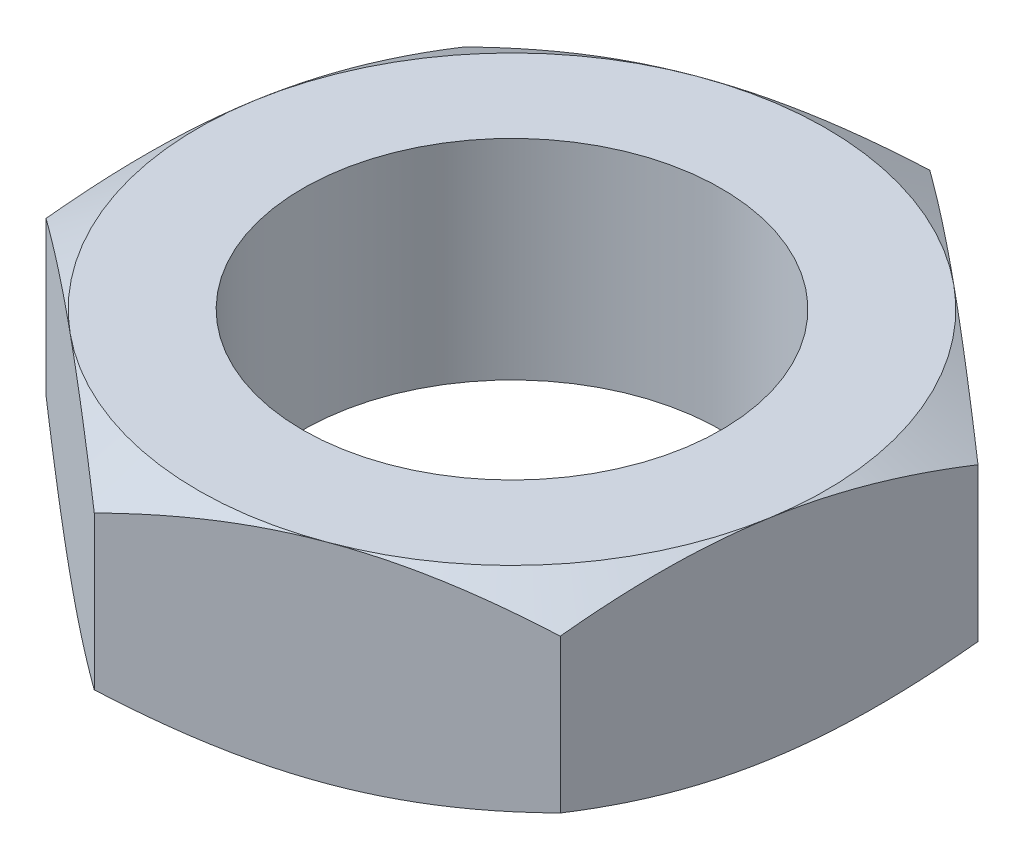
ISO-10303-21;
HEADER;
FILE_DESCRIPTION(('STEP AP214'),'2;1');
FILE_NAME('part.step','',(''),(''),'','','');
FILE_SCHEMA(('AUTOMOTIVE_DESIGN { 1 0 10303 214 1 1 1 1 }'));
ENDSEC;
DATA;
#1=APPLICATION_CONTEXT('core data for automotive mechanical design processes');
#2=APPLICATION_PROTOCOL_DEFINITION('international standard','automotive_design',2000,#1);
#3=PRODUCT_CONTEXT('',#1,'mechanical');
#4=PRODUCT('Part','Part','',(#3));
#5=PRODUCT_RELATED_PRODUCT_CATEGORY('part','',(#4));
#6=PRODUCT_DEFINITION_FORMATION('','',#4);
#7=PRODUCT_DEFINITION_CONTEXT('part definition',#1,'design');
#8=PRODUCT_DEFINITION('design','',#6,#7);
#9=PRODUCT_DEFINITION_SHAPE('','',#8);
#10=(LENGTH_UNIT() NAMED_UNIT(*) SI_UNIT(.MILLI.,.METRE.));
#11=(NAMED_UNIT(*) PLANE_ANGLE_UNIT() SI_UNIT($,.RADIAN.));
#12=(NAMED_UNIT(*) SI_UNIT($,.STERADIAN.) SOLID_ANGLE_UNIT());
#13=UNCERTAINTY_MEASURE_WITH_UNIT(LENGTH_MEASURE(1.E-05),#10,'distance_accuracy_value','');
#14=(GEOMETRIC_REPRESENTATION_CONTEXT(3) GLOBAL_UNCERTAINTY_ASSIGNED_CONTEXT((#13)) GLOBAL_UNIT_ASSIGNED_CONTEXT((#10,
#11,#12)) REPRESENTATION_CONTEXT('',''));
#15=CARTESIAN_POINT('',(0.,0.,0.));
#16=DIRECTION('',(0.,0.,1.));
#17=DIRECTION('',(1.,0.,0.));
#18=AXIS2_PLACEMENT_3D('',#15,#16,#17);
#19=CARTESIAN_POINT('',(-1.44369467023749,5.,8.53907171179209));
#20=DIRECTION('',(-0.34863406811952,0.,-0.937258921828133));
#21=DIRECTION('',(-0.937258921828133,0.,0.34863406811952));
#22=AXIS2_PLACEMENT_3D('',#19,#20,#21);
#23=PLANE('',#22);
#24=CARTESIAN_POINT('',(6.67340569203028,0.669934582085275,5.51973772123151));
#25=CARTESIAN_POINT('',(6.49498732644152,0.61499041368803,5.58610435607892));
#26=CARTESIAN_POINT('',(6.31590373120375,0.562539844764627,5.65271843772397));
#27=CARTESIAN_POINT('',(5.95628219341445,0.463312688605474,5.78648757748136));
#28=CARTESIAN_POINT('',(5.77574365902302,0.416538549046466,5.85364285574156));
#29=CARTESIAN_POINT('',(5.23123744179099,0.285648891076474,6.05618391799114));
#30=CARTESIAN_POINT('',(4.86512041892743,0.211200490063354,6.19236919627024));
#31=CARTESIAN_POINT('',(4.31723296252882,0.123901221271782,6.39616798478786));
#32=CARTESIAN_POINT('',(4.13709953241467,0.0990322370979437,6.46317257560309));
#33=CARTESIAN_POINT('',(3.77601876178583,0.0573306993877993,6.59748450910651));
#34=CARTESIAN_POINT('',(3.59507149461047,0.0404974357964017,6.66479182451452));
#35=CARTESIAN_POINT('',(3.23286270958824,0.0152963397422831,6.79952334777878));
#36=CARTESIAN_POINT('',(3.05160178328159,0.00691890019796405,6.86694733559865));
#37=CARTESIAN_POINT('',(2.68892251831363,-0.00119990207370901,7.0018538642255));
#38=CARTESIAN_POINT('',(2.50750418468866,-0.000941531608342203,7.0693364031591));
#39=CARTESIAN_POINT('',(2.01048216082673,0.0116366203444909,7.25421467541497));
#40=CARTESIAN_POINT('',(1.69504118336627,0.032750367326311,7.37154988414164));
#41=CARTESIAN_POINT('',(1.06625435166348,0.0997010500425559,7.60544097443817));
#42=CARTESIAN_POINT('',(0.752910708611471,0.145560867086196,7.72199603350715));
#43=CARTESIAN_POINT('',(0.122858541479935,0.260196634976687,7.95635779314358));
#44=CARTESIAN_POINT('',(-0.19377048564775,0.32945826489346,8.0741349230715));
#45=CARTESIAN_POINT('',(-0.822306823607496,0.486654039468555,8.30793283671146));
#46=CARTESIAN_POINT('',(-1.13422218333332,0.574551261711175,8.42395661438654));
#47=CARTESIAN_POINT('',(-1.44389467023749,0.669934582085275,8.53914610619048));
#48=B_SPLINE_CURVE_WITH_KNOTS('',3,(#24,#25,#26,#27,#28,#29,#30,#31,#32,#33,#34,#35,#36,#37,#38,
#39,#40,#41,#42,#43,#44,#45,#46,#47),.UNSPECIFIED.,.F.,.F.,(4,2,2,2,2,2,2,2,2,2,2,4),(0.,
0.594350167566524,1.18895571516085,2.38063749631713,2.96188394546358,3.54307902480116,
4.12361303374696,4.70412910684701,5.71472439101079,6.7262557214494,7.76022088252539,
8.79215629474527),.UNSPECIFIED.);
#49=CARTESIAN_POINT('',(6.67320569203028,0.669872981077802,5.5198121156299));
#50=VERTEX_POINT('',#49);
#51=CARTESIAN_POINT('',(2.6147555108964,0.,7.029441913711));
#52=VERTEX_POINT('',#51);
#53=EDGE_CURVE('E129',#50,#52,#48,.T.);
#54=ORIENTED_EDGE('',*,*,#53,.F.);
#55=DIRECTION('',(0.,-1.,0.));
#56=VECTOR('',#55,1.);
#57=CARTESIAN_POINT('',(6.67320569203028,5.,5.5198121156299));
#58=LINE('',#57,#56);
#59=CARTESIAN_POINT('',(6.67320569203028,4.3301270189222,5.5198121156299));
#60=VERTEX_POINT('',#59);
#61=EDGE_CURVE('E260',#60,#50,#58,.T.);
#62=ORIENTED_EDGE('',*,*,#61,.F.);
#63=CARTESIAN_POINT('',(-1.44389467023749,4.33006541791473,8.53914610619048));
#64=CARTESIAN_POINT('',(-1.26547630464873,4.38500958631197,8.47277947134307));
#65=CARTESIAN_POINT('',(-1.08639270941096,4.43746015523537,8.40616538969802));
#66=CARTESIAN_POINT('',(-0.726771171621659,4.53668731139453,8.27239624994063));
#67=CARTESIAN_POINT('',(-0.54623263723023,4.58346145095353,8.20524097168044));
#68=CARTESIAN_POINT('',(-0.00172641999819813,4.71435110892353,8.00269990943085));
#69=CARTESIAN_POINT('',(0.364390602865364,4.78879950993665,7.86651463115175));
#70=CARTESIAN_POINT('',(0.912278059263968,4.87609877872822,7.66271584263413));
#71=CARTESIAN_POINT('',(1.09241148937812,4.90096776290206,7.5957112518189));
#72=CARTESIAN_POINT('',(1.45349226000696,4.9426693006122,7.46139931831548));
#73=CARTESIAN_POINT('',(1.63443952718232,4.9595025642036,7.39409200290748));
#74=CARTESIAN_POINT('',(1.99664831220455,4.98470366025772,7.25936047964321));
#75=CARTESIAN_POINT('',(2.1779092385112,4.99308109980204,7.19193649182334));
#76=CARTESIAN_POINT('',(2.54058850347916,5.00119990207371,7.0570299631965));
#77=CARTESIAN_POINT('',(2.72200683710413,5.00094153160834,6.98954742426289));
#78=CARTESIAN_POINT('',(3.21902886096606,4.98836337965551,6.80466915200702));
#79=CARTESIAN_POINT('',(3.53446983842652,4.96724963267369,6.68733394328035));
#80=CARTESIAN_POINT('',(4.16325667012932,4.90029894995745,6.45344285298383));
#81=CARTESIAN_POINT('',(4.47660031318132,4.85443913291381,6.33688779391484));
#82=CARTESIAN_POINT('',(5.10665248031286,4.73980336502331,6.10252603427841));
#83=CARTESIAN_POINT('',(5.42328150744054,4.67054173510654,5.98474890435049));
#84=CARTESIAN_POINT('',(6.05181784540029,4.51334596053145,5.75095099071054));
#85=CARTESIAN_POINT('',(6.36373320512611,4.42544873828883,5.63492721303545));
#86=CARTESIAN_POINT('',(6.67340569203028,4.33006541791473,5.51973772123151));
#87=B_SPLINE_CURVE_WITH_KNOTS('',3,(#63,#64,#65,#66,#67,#68,#69,#70,#71,#72,#73,#74,#75,#76,#77,
#78,#79,#80,#81,#82,#83,#84,#85,#86),.UNSPECIFIED.,.F.,.F.,(4,2,2,2,2,2,2,2,2,2,2,4),(0.,
0.594350167566525,1.18895571516085,2.38063749631713,2.96188394546359,3.54307902480116,
4.12361303374696,4.70412910684701,5.71472439101079,6.72625572144941,7.76022088252539,
8.79215629474527),.UNSPECIFIED.);
#88=CARTESIAN_POINT('',(2.6147555108964,5.,7.029441913711));
#89=VERTEX_POINT('',#88);
#90=EDGE_CURVE('E240',#89,#60,#87,.T.);
#91=ORIENTED_EDGE('',*,*,#90,.F.);
#92=CARTESIAN_POINT('',(-1.44369467023749,4.3301270189222,8.53907171179209));
#93=VERTEX_POINT('',#92);
#94=EDGE_CURVE('E246',#93,#89,#87,.T.);
#95=ORIENTED_EDGE('',*,*,#94,.F.);
#96=DIRECTION('',(0.,-1.,0.));
#97=VECTOR('',#96,1.);
#98=CARTESIAN_POINT('',(-1.44369467023749,5.,8.53907171179209));
#99=LINE('',#98,#97);
#100=CARTESIAN_POINT('',(-1.44369467023749,0.669872981077804,8.53907171179209));
#101=VERTEX_POINT('',#100);
#102=EDGE_CURVE('E159',#93,#101,#99,.T.);
#103=ORIENTED_EDGE('',*,*,#102,.T.);
#104=EDGE_CURVE('E141',#52,#101,#48,.T.);
#105=ORIENTED_EDGE('',*,*,#104,.F.);
#106=EDGE_LOOP('',(#54,#62,#91,#95,#103,#105));
#107=FACE_BOUND('',#106,.T.);
#108=ADVANCED_FACE('F39',(#107),#23,.F.);
#109=CARTESIAN_POINT('',(6.67320569203028,5.,5.5198121156299));
#110=DIRECTION('',(-0.986007070286536,0.,-0.166703501297848));
#111=DIRECTION('',(-0.166703501297848,0.,0.986007070286536));
#112=AXIS2_PLACEMENT_3D('',#109,#110,#111);
#113=PLANE('',#112);
#114=CARTESIAN_POINT('',(8.11693417612292,0.669931536480535,-3.01945959616219));
#115=CARTESIAN_POINT('',(8.08520019987834,0.614987494088027,-2.83176152922384));
#116=CARTESIAN_POINT('',(8.05334790409476,0.562537054216301,-2.64336363354107));
#117=CARTESIAN_POINT('',(7.98938463854219,0.463310161762978,-2.26503785404365));
#118=CARTESIAN_POINT('',(7.95727356350703,0.416536156859956,-2.07510934760759));
#119=CARTESIAN_POINT('',(7.86042620741353,0.285646912260097,-1.50228287963715));
#120=CARTESIAN_POINT('',(7.79530763940616,0.211198797092288,-1.1171237920216));
#121=CARTESIAN_POINT('',(7.69785888875528,0.123899954229493,-0.54074023448197));
#122=CARTESIAN_POINT('',(7.66581986681431,0.0990311093659153,-0.351237903019766));
#123=CARTESIAN_POINT('',(7.60159705945798,0.0573298489513181,0.0286229975251619));
#124=CARTESIAN_POINT('',(7.56941328708685,0.0404967233463565,0.218981489454665));
#125=CARTESIAN_POINT('',(7.50498984963335,0.0152958983657101,0.600029063901352));
#126=CARTESIAN_POINT('',(7.47275028976229,0.00691859196391466,0.790717524121497));
#127=CARTESIAN_POINT('',(7.40824317319374,-0.00119995198440777,1.17226003837705));
#128=CARTESIAN_POINT('',(7.37597561739202,-0.000941456342233854,1.36311408711427));
#129=CARTESIAN_POINT('',(7.2875741645718,0.0116369901313172,1.88598527353643));
#130=CARTESIAN_POINT('',(7.23146920871259,0.0327507878641885,2.21783123192727));
#131=CARTESIAN_POINT('',(7.11963193933104,0.0997013333310604,2.87931906795497));
#132=CARTESIAN_POINT('',(7.06390001908873,0.145560961828871,3.20895861944455));
#133=CARTESIAN_POINT('',(6.95183769884847,0.260196141216312,3.87177757171231));
#134=CARTESIAN_POINT('',(6.89552143817182,0.329457363606809,4.20487334214886));
#135=CARTESIAN_POINT('',(6.78372872548718,0.486652168279931,4.86609763711207));
#136=CARTESIAN_POINT('',(6.72825084191222,0.574548828915974,5.19423462897829));
#137=CARTESIAN_POINT('',(6.67317187817512,0.669931536480537,5.5200121156299));
#138=B_SPLINE_CURVE_WITH_KNOTS('',3,(#114,#115,#116,#117,#118,#119,#120,#121,#122,#123,#124,
#125,#126,#127,#128,#129,#130,#131,#132,#133,#134,#135,#136,#137),.UNSPECIFIED.,.F.,.F.,(4,2,2,
2,2,2,2,2,2,2,2,4),(0.,0.594349806644115,1.18895499310351,2.380636032122,2.96188215456027,
3.54307690729336,4.12361059346092,4.70412634350593,5.71471695893529,6.72624360304106,
7.76020382983172,8.79213434275382),.UNSPECIFIED.);
#139=CARTESIAN_POINT('',(8.11690036226776,0.669872981077801,-3.01925959616219));
#140=VERTEX_POINT('',#139);
#141=CARTESIAN_POINT('',(7.39505302714902,0.,1.25027625973386));
#142=VERTEX_POINT('',#141);
#143=EDGE_CURVE('E56',#140,#142,#138,.T.);
#144=ORIENTED_EDGE('',*,*,#143,.F.);
#145=DIRECTION('',(0.,-1.,0.));
#146=VECTOR('',#145,1.);
#147=CARTESIAN_POINT('',(8.11690036226776,5.,-3.01925959616219));
#148=LINE('',#147,#146);
#149=CARTESIAN_POINT('',(8.11690036226776,4.3301270189222,-3.01925959616219));
#150=VERTEX_POINT('',#149);
#151=EDGE_CURVE('E257',#150,#140,#148,.T.);
#152=ORIENTED_EDGE('',*,*,#151,.F.);
#153=CARTESIAN_POINT('',(6.67317187817512,4.33006846351947,5.5200121156299));
#154=CARTESIAN_POINT('',(6.7049058544197,4.38501250591197,5.33231404869155));
#155=CARTESIAN_POINT('',(6.73675815020328,4.4374629457837,5.14391615300878));
#156=CARTESIAN_POINT('',(6.80072141575585,4.53668983823702,4.76559037351137));
#157=CARTESIAN_POINT('',(6.83283249079101,4.58346384314005,4.57566186707531));
#158=CARTESIAN_POINT('',(6.92967984688451,4.71435308773991,4.00283539910487));
#159=CARTESIAN_POINT('',(6.99479841489188,4.78880120290771,3.61767631148931));
#160=CARTESIAN_POINT('',(7.09224716554276,4.87610004577051,3.04129275394969));
#161=CARTESIAN_POINT('',(7.12428618748373,4.90096889063409,2.85179042248748));
#162=CARTESIAN_POINT('',(7.18850899484006,4.94267015104868,2.47192952194255));
#163=CARTESIAN_POINT('',(7.22069276721119,4.95950327665364,2.28157103001305));
#164=CARTESIAN_POINT('',(7.28511620466469,4.98470410163429,1.90052345556636));
#165=CARTESIAN_POINT('',(7.31735576453575,4.99308140803609,1.70983499534622));
#166=CARTESIAN_POINT('',(7.3818628811043,5.00119995198441,1.32829248109066));
#167=CARTESIAN_POINT('',(7.41413043690602,5.00094145634224,1.13743843235345));
#168=CARTESIAN_POINT('',(7.50253188972624,4.98836300986868,0.61456724593129));
#169=CARTESIAN_POINT('',(7.55863684558545,4.96724921213581,0.282721287540443));
#170=CARTESIAN_POINT('',(7.670474114967,4.90029866666894,-0.378766548487257));
#171=CARTESIAN_POINT('',(7.72620603520931,4.85443903817113,-0.708406099976839));
#172=CARTESIAN_POINT('',(7.83826835544957,4.73980385878369,-1.3712250522446));
#173=CARTESIAN_POINT('',(7.89458461612622,4.67054263639319,-1.70432082268115));
#174=CARTESIAN_POINT('',(8.00637732881086,4.51334783172007,-2.36554511764435));
#175=CARTESIAN_POINT('',(8.06185521238582,4.42545117108403,-2.69368210951058));
#176=CARTESIAN_POINT('',(8.11693417612292,4.33006846351947,-3.01945959616219));
#177=B_SPLINE_CURVE_WITH_KNOTS('',3,(#153,#154,#155,#156,#157,#158,#159,#160,#161,#162,#163,
#164,#165,#166,#167,#168,#169,#170,#171,#172,#173,#174,#175,#176),.UNSPECIFIED.,.F.,.F.,(4,2,2,
2,2,2,2,2,2,2,2,4),(0.,0.594349806644116,1.18895499310351,2.380636032122,2.96188215456027,
3.54307690729336,4.12361059346092,4.70412634350593,5.71471695893529,6.72624360304106,
7.76020382983172,8.79213434275382),.UNSPECIFIED.);
#178=CARTESIAN_POINT('',(7.39505302714903,5.,1.25027625973386));
#179=VERTEX_POINT('',#178);
#180=EDGE_CURVE('E225',#179,#150,#177,.T.);
#181=ORIENTED_EDGE('',*,*,#180,.F.);
#182=EDGE_CURVE('E232',#60,#179,#177,.T.);
#183=ORIENTED_EDGE('',*,*,#182,.F.);
#184=ORIENTED_EDGE('',*,*,#61,.T.);
#185=EDGE_CURVE('E135',#142,#50,#138,.T.);
#186=ORIENTED_EDGE('',*,*,#185,.F.);
#187=EDGE_LOOP('',(#144,#152,#181,#183,#184,#186));
#188=FACE_BOUND('',#187,.T.);
#189=ADVANCED_FACE('F217',(#188),#113,.F.);
#190=CARTESIAN_POINT('',(8.11690036226776,5.,-3.01925959616219));
#191=DIRECTION('',(-0.637373002167017,0.,0.770555420530285));
#192=DIRECTION('',(0.770555420530285,0.,0.637373002167017));
#193=AXIS2_PLACEMENT_3D('',#190,#191,#192);
#194=PLANE('',#193);
#195=CARTESIAN_POINT('',(1.44349467023748,0.669947909270021,-8.53923714389085));
#196=CARTESIAN_POINT('',(1.59017934429502,0.615003189494995,-8.41790537646054));
#197=CARTESIAN_POINT('',(1.73741092985964,0.562552055860879,-8.29612122543796));
#198=CARTESIAN_POINT('',(2.03306978023781,0.463323745764641,-8.05156390475479));
#199=CARTESIAN_POINT('',(2.18149753162803,0.416549016971252,-7.9287903326172));
#200=CARTESIAN_POINT('',(2.62915730228068,0.285657550155301,-7.55850385565761));
#201=CARTESIAN_POINT('',(2.93015638802546,0.211207898325488,-7.30952930325144));
#202=CARTESIAN_POINT('',(3.38059604417728,0.123906765731987,-6.93694341482957));
#203=CARTESIAN_POINT('',(3.52869074651669,0.099037171956829,-6.81444532770932));
#204=CARTESIAN_POINT('',(3.82554931567242,0.0573344208415764,-6.56889564704964));
#205=CARTESIAN_POINT('',(3.97431312219173,0.040500553441359,-6.44584410338552));
#206=CARTESIAN_POINT('',(4.27209910847214,0.0152982712082999,-6.19952729991901));
#207=CARTESIAN_POINT('',(4.4211208018718,0.00692024905105455,-6.07626244241559));
#208=CARTESIAN_POINT('',(4.71929362297594,-0.001199683607605,-5.82962566446526));
#209=CARTESIAN_POINT('',(4.86844474653956,-0.000941860898707258,-5.7062537474435));
#210=CARTESIAN_POINT('',(5.27707067658355,0.0116350022508556,-5.36825452135774));
#211=CARTESIAN_POINT('',(5.53641172314486,0.0327485271370408,-5.15373785321444));
#212=CARTESIAN_POINT('',(6.05337129392387,0.0996998104171768,-4.72612931936019));
#213=CARTESIAN_POINT('',(6.31098800006821,0.14556045250706,-4.51303895748772));
#214=CARTESIAN_POINT('',(6.82898795637013,0.260198795605913,-4.08456985783058));
#215=CARTESIAN_POINT('',(7.0893058444828,0.329462208806821,-3.86924518494726));
#216=CARTESIAN_POINT('',(7.60605953930169,0.486662227553499,-3.44180694355387));
#217=CARTESIAN_POINT('',(7.86250196394722,0.574561907317877,-3.22968790094584));
#218=CARTESIAN_POINT('',(8.11710036226776,0.669947909270021,-3.01909416406342));
#219=B_SPLINE_CURVE_WITH_KNOTS('',3,(#195,#196,#197,#198,#199,#200,#201,#202,#203,#204,#205,
#206,#207,#208,#209,#210,#211,#212,#213,#214,#215,#216,#217,#218),.UNSPECIFIED.,.F.,.F.,(4,2,2,
2,2,2,2,2,2,2,2,4),(0.,0.594351746917322,1.18895887479238,2.38064390344968,2.96189178223027,
3.54308829074832,4.12362371213127,4.70414119887973,5.71475691272487,6.72630874985524,
7.76029550264454,8.792252353473),.UNSPECIFIED.);
#220=CARTESIAN_POINT('',(1.44369467023748,0.669872981077803,-8.53907171179209));
#221=VERTEX_POINT('',#220);
#222=CARTESIAN_POINT('',(4.78029751625262,0.,-5.77916565397714));
#223=VERTEX_POINT('',#222);
#224=EDGE_CURVE('E63',#221,#223,#219,.T.);
#225=ORIENTED_EDGE('',*,*,#224,.F.);
#226=DIRECTION('',(0.,-1.,0.));
#227=VECTOR('',#226,1.);
#228=CARTESIAN_POINT('',(1.44369467023748,5.,-8.53907171179209));
#229=LINE('',#228,#227);
#230=CARTESIAN_POINT('',(1.44369467023748,4.3301270189222,-8.53907171179209));
#231=VERTEX_POINT('',#230);
#232=EDGE_CURVE('E254',#231,#221,#229,.T.);
#233=ORIENTED_EDGE('',*,*,#232,.F.);
#234=CARTESIAN_POINT('',(8.11710036226776,4.33005209072998,-3.01909416406342));
#235=CARTESIAN_POINT('',(7.97041568821022,4.38499681050501,-3.14042593149373));
#236=CARTESIAN_POINT('',(7.82318410264561,4.43744794413912,-3.26221008251631));
#237=CARTESIAN_POINT('',(7.52752525226744,4.53667625423536,-3.50676740319948));
#238=CARTESIAN_POINT('',(7.37909750087722,4.58345098302875,-3.62954097533707));
#239=CARTESIAN_POINT('',(6.93143773022457,4.7143424498447,-3.99982745229667));
#240=CARTESIAN_POINT('',(6.63043864447979,4.78879210167451,-4.24880200470283));
#241=CARTESIAN_POINT('',(6.17999898832797,4.87609323426802,-4.62138789312471));
#242=CARTESIAN_POINT('',(6.03190428598856,4.90096282804317,-4.74388598024496));
#243=CARTESIAN_POINT('',(5.73504571683282,4.94266557915843,-4.98943566090464));
#244=CARTESIAN_POINT('',(5.58628191031351,4.95949944655864,-5.11248720456875));
#245=CARTESIAN_POINT('',(5.28849592403311,4.9847017287917,-5.35880400803526));
#246=CARTESIAN_POINT('',(5.13947423063345,4.99307975094895,-5.48206886553868));
#247=CARTESIAN_POINT('',(4.8413014095293,5.00119968360761,-5.72870564348902));
#248=CARTESIAN_POINT('',(4.69215028596569,5.00094186089871,-5.85207756051077));
#249=CARTESIAN_POINT('',(4.2835243559217,4.98836499774915,-6.19007678659654));
#250=CARTESIAN_POINT('',(4.02418330936039,4.96725147286296,-6.40459345473984));
#251=CARTESIAN_POINT('',(3.50722373858137,4.90030018958282,-6.83220198859408));
#252=CARTESIAN_POINT('',(3.24960703243704,4.85443954749294,-7.04529235046655));
#253=CARTESIAN_POINT('',(2.73160707613511,4.73980120439409,-7.4737614501237));
#254=CARTESIAN_POINT('',(2.47128918802245,4.67053779119318,-7.68908612300701));
#255=CARTESIAN_POINT('',(1.95453549320355,4.5133377724465,-8.11652436440041));
#256=CARTESIAN_POINT('',(1.69809306855803,4.42543809268212,-8.32864340700843));
#257=CARTESIAN_POINT('',(1.44349467023748,4.33005209072998,-8.53923714389085));
#258=B_SPLINE_CURVE_WITH_KNOTS('',3,(#234,#235,#236,#237,#238,#239,#240,#241,#242,#243,#244,
#245,#246,#247,#248,#249,#250,#251,#252,#253,#254,#255,#256,#257),.UNSPECIFIED.,.F.,.F.,(4,2,2,
2,2,2,2,2,2,2,2,4),(0.,0.594351746917321,1.18895887479238,2.38064390344968,2.96189178223027,
3.54308829074832,4.12362371213127,4.70414119887973,5.71475691272487,6.72630874985524,
7.76029550264454,8.79225235347299),.UNSPECIFIED.);
#259=CARTESIAN_POINT('',(4.78029751625262,5.,-5.77916565397714));
#260=VERTEX_POINT('',#259);
#261=EDGE_CURVE('E234',#260,#231,#258,.T.);
#262=ORIENTED_EDGE('',*,*,#261,.F.);
#263=EDGE_CURVE('E233',#150,#260,#258,.T.);
#264=ORIENTED_EDGE('',*,*,#263,.F.);
#265=ORIENTED_EDGE('',*,*,#151,.T.);
#266=EDGE_CURVE('E210',#223,#140,#219,.T.);
#267=ORIENTED_EDGE('',*,*,#266,.F.);
#268=EDGE_LOOP('',(#225,#233,#262,#264,#265,#267));
#269=FACE_BOUND('',#268,.T.);
#270=ADVANCED_FACE('F220',(#269),#194,.F.);
#271=CARTESIAN_POINT('',(1.44369467023748,5.,-8.53907171179209));
#272=DIRECTION('',(0.34863406811952,0.,0.937258921828133));
#273=DIRECTION('',(0.937258921828133,0.,-0.34863406811952));
#274=AXIS2_PLACEMENT_3D('',#271,#272,#273);
#275=PLANE('',#274);
#276=CARTESIAN_POINT('',(-6.67340569203028,0.669934582085276,-5.51973772123151));
#277=CARTESIAN_POINT('',(-6.49498732644152,0.614990413688031,-5.58610435607892));
#278=CARTESIAN_POINT('',(-6.31590373120376,0.562539844764629,-5.65271843772398));
#279=CARTESIAN_POINT('',(-5.95628219341445,0.463312688605475,-5.78648757748136));
#280=CARTESIAN_POINT('',(-5.77574365902302,0.416538549046468,-5.85364285574156));
#281=CARTESIAN_POINT('',(-5.23123744179099,0.285648891076476,-6.05618391799115));
#282=CARTESIAN_POINT('',(-4.86512041892743,0.211200490063354,-6.19236919627024));
#283=CARTESIAN_POINT('',(-4.31723296252883,0.123901221271783,-6.39616798478786));
#284=CARTESIAN_POINT('',(-4.13709953241467,0.0990322370979451,-6.46317257560309));
#285=CARTESIAN_POINT('',(-3.77601876178583,0.0573306993878009,-6.59748450910651));
#286=CARTESIAN_POINT('',(-3.59507149461047,0.0404974357964031,-6.66479182451452));
#287=CARTESIAN_POINT('',(-3.23286270958824,0.0152963397422842,-6.79952334777878));
#288=CARTESIAN_POINT('',(-3.05160178328159,0.00691890019796537,-6.86694733559865));
#289=CARTESIAN_POINT('',(-2.68892251831363,-0.00119990207370782,-7.0018538642255));
#290=CARTESIAN_POINT('',(-2.50750418468866,-0.000941531608341314,-7.0693364031591));
#291=CARTESIAN_POINT('',(-2.01048216082673,0.0116366203444914,-7.25421467541497));
#292=CARTESIAN_POINT('',(-1.69504118336627,0.0327503673263117,-7.37154988414164));
#293=CARTESIAN_POINT('',(-1.06625435166348,0.0997010500425567,-7.60544097443817));
#294=CARTESIAN_POINT('',(-0.752910708611473,0.145560867086196,-7.72199603350715));
#295=CARTESIAN_POINT('',(-0.122858541479938,0.260196634976688,-7.95635779314358));
#296=CARTESIAN_POINT('',(0.193770485647746,0.329458264893461,-8.0741349230715));
#297=CARTESIAN_POINT('',(0.822306823607492,0.486654039468556,-8.30793283671146));
#298=CARTESIAN_POINT('',(1.13422218333331,0.574551261711175,-8.42395661438654));
#299=CARTESIAN_POINT('',(1.44389467023748,0.669934582085276,-8.53914610619048));
#300=B_SPLINE_CURVE_WITH_KNOTS('',3,(#276,#277,#278,#279,#280,#281,#282,#283,#284,#285,#286,
#287,#288,#289,#290,#291,#292,#293,#294,#295,#296,#297,#298,#299),.UNSPECIFIED.,.F.,.F.,(4,2,2,
2,2,2,2,2,2,2,2,4),(0.,0.594350167566525,1.18895571516085,2.38063749631713,2.96188394546359,
3.54307902480116,4.12361303374696,4.70412910684701,5.71472439101079,6.7262557214494,
7.76022088252539,8.79215629474526),.UNSPECIFIED.);
#301=CARTESIAN_POINT('',(-6.67320569203028,0.669872981077805,-5.5198121156299));
#302=VERTEX_POINT('',#301);
#303=CARTESIAN_POINT('',(-2.6147555108964,0.,-7.029441913711));
#304=VERTEX_POINT('',#303);
#305=EDGE_CURVE('E174',#302,#304,#300,.T.);
#306=ORIENTED_EDGE('',*,*,#305,.F.);
#307=DIRECTION('',(0.,-1.,0.));
#308=VECTOR('',#307,1.);
#309=CARTESIAN_POINT('',(-6.67320569203028,5.,-5.5198121156299));
#310=LINE('',#309,#308);
#311=CARTESIAN_POINT('',(-6.67320569203028,4.3301270189222,-5.5198121156299));
#312=VERTEX_POINT('',#311);
#313=EDGE_CURVE('E251',#312,#302,#310,.T.);
#314=ORIENTED_EDGE('',*,*,#313,.F.);
#315=CARTESIAN_POINT('',(1.44389467023748,4.33006541791473,-8.53914610619048));
#316=CARTESIAN_POINT('',(1.26547630464872,4.38500958631197,-8.47277947134307));
#317=CARTESIAN_POINT('',(1.08639270941096,4.43746015523537,-8.40616538969802));
#318=CARTESIAN_POINT('',(0.726771171621654,4.53668731139453,-8.27239624994063));
#319=CARTESIAN_POINT('',(0.546232637230225,4.58346145095354,-8.20524097168044));
#320=CARTESIAN_POINT('',(0.00172641999819276,4.71435110892353,-8.00269990943085));
#321=CARTESIAN_POINT('',(-0.364390602865369,4.78879950993665,-7.86651463115175));
#322=CARTESIAN_POINT('',(-0.912278059263973,4.87609877872822,-7.66271584263413));
#323=CARTESIAN_POINT('',(-1.09241148937812,4.90096776290206,-7.5957112518189));
#324=CARTESIAN_POINT('',(-1.45349226000697,4.9426693006122,-7.46139931831548));
#325=CARTESIAN_POINT('',(-1.63443952718233,4.9595025642036,-7.39409200290748));
#326=CARTESIAN_POINT('',(-1.99664831220456,4.98470366025772,-7.25936047964321));
#327=CARTESIAN_POINT('',(-2.17790923851121,4.99308109980204,-7.19193649182334));
#328=CARTESIAN_POINT('',(-2.54058850347917,5.00119990207371,-7.0570299631965));
#329=CARTESIAN_POINT('',(-2.72200683710414,5.00094153160834,-6.98954742426289));
#330=CARTESIAN_POINT('',(-3.21902886096607,4.98836337965551,-6.80466915200702));
#331=CARTESIAN_POINT('',(-3.53446983842653,4.96724963267369,-6.68733394328035));
#332=CARTESIAN_POINT('',(-4.16325667012932,4.90029894995744,-6.45344285298383));
#333=CARTESIAN_POINT('',(-4.47660031318133,4.85443913291381,-6.33688779391484));
#334=CARTESIAN_POINT('',(-5.10665248031286,4.73980336502331,-6.10252603427841));
#335=CARTESIAN_POINT('',(-5.42328150744054,4.67054173510654,-5.98474890435049));
#336=CARTESIAN_POINT('',(-6.05181784540029,4.51334596053145,-5.75095099071054));
#337=CARTESIAN_POINT('',(-6.36373320512611,4.42544873828883,-5.63492721303545));
#338=CARTESIAN_POINT('',(-6.67340569203028,4.33006541791473,-5.51973772123151));
#339=B_SPLINE_CURVE_WITH_KNOTS('',3,(#315,#316,#317,#318,#319,#320,#321,#322,#323,#324,#325,
#326,#327,#328,#329,#330,#331,#332,#333,#334,#335,#336,#337,#338),.UNSPECIFIED.,.F.,.F.,(4,2,2,
2,2,2,2,2,2,2,2,4),(0.,0.594350167566525,1.18895571516085,2.38063749631713,2.96188394546359,
3.54307902480116,4.12361303374696,4.70412910684701,5.71472439101079,6.7262557214494,
7.76022088252539,8.79215629474526),.UNSPECIFIED.);
#340=CARTESIAN_POINT('',(-2.6147555108964,5.,-7.029441913711));
#341=VERTEX_POINT('',#340);
#342=EDGE_CURVE('E296',#341,#312,#339,.T.);
#343=ORIENTED_EDGE('',*,*,#342,.F.);
#344=EDGE_CURVE('E463',#231,#341,#339,.T.);
#345=ORIENTED_EDGE('',*,*,#344,.F.);
#346=ORIENTED_EDGE('',*,*,#232,.T.);
#347=EDGE_CURVE('E442',#304,#221,#300,.T.);
#348=ORIENTED_EDGE('',*,*,#347,.F.);
#349=EDGE_LOOP('',(#306,#314,#343,#345,#346,#348));
#350=FACE_BOUND('',#349,.T.);
#351=ADVANCED_FACE('F314',(#350),#275,.F.);
#352=CARTESIAN_POINT('',(-6.67320569203028,5.,-5.5198121156299));
#353=DIRECTION('',(0.986007070286536,0.,0.166703501297848));
#354=DIRECTION('',(0.166703501297848,0.,-0.986007070286536));
#355=AXIS2_PLACEMENT_3D('',#352,#353,#354);
#356=PLANE('',#355);
#357=CARTESIAN_POINT('',(-8.11693417612292,0.669931536480537,3.01945959616219));
#358=CARTESIAN_POINT('',(-8.08520019987835,0.614987494088029,2.83176152922383));
#359=CARTESIAN_POINT('',(-8.05334790409477,0.562537054216303,2.64336363354107));
#360=CARTESIAN_POINT('',(-7.98938463854219,0.46331016176298,2.26503785404365));
#361=CARTESIAN_POINT('',(-7.95727356350704,0.416536156859959,2.07510934760759));
#362=CARTESIAN_POINT('',(-7.86042620741353,0.2856469122601,1.50228287963715));
#363=CARTESIAN_POINT('',(-7.79530763940617,0.211198797092291,1.1171237920216));
#364=CARTESIAN_POINT('',(-7.69785888875528,0.123899954229495,0.540740234481969));
#365=CARTESIAN_POINT('',(-7.66581986681432,0.0990311093659178,0.351237903019765));
#366=CARTESIAN_POINT('',(-7.60159705945799,0.0573298489513206,-0.0286229975251634));
#367=CARTESIAN_POINT('',(-7.56941328708686,0.040496723346359,-0.218981489454666));
#368=CARTESIAN_POINT('',(-7.50498984963335,0.0152958983657124,-0.600029063901353));
#369=CARTESIAN_POINT('',(-7.47275028976229,0.00691859196391687,-0.790717524121499));
#370=CARTESIAN_POINT('',(-7.40824317319375,-0.00119995198440546,-1.17226003837705));
#371=CARTESIAN_POINT('',(-7.37597561739202,-0.000941456342231365,-1.36311408711427));
#372=CARTESIAN_POINT('',(-7.28757416457181,0.0116369901313199,-1.88598527353643));
#373=CARTESIAN_POINT('',(-7.2314692087126,0.0327507878641912,-2.21783123192727));
#374=CARTESIAN_POINT('',(-7.11963193933104,0.0997013333310627,-2.87931906795497));
#375=CARTESIAN_POINT('',(-7.06390001908873,0.145560961828873,-3.20895861944456));
#376=CARTESIAN_POINT('',(-6.95183769884847,0.260196141216313,-3.87177757171231));
#377=CARTESIAN_POINT('',(-6.89552143817182,0.32945736360681,-4.20487334214886));
#378=CARTESIAN_POINT('',(-6.78372872548718,0.486652168279932,-4.86609763711207));
#379=CARTESIAN_POINT('',(-6.72825084191222,0.574548828915975,-5.19423462897829));
#380=CARTESIAN_POINT('',(-6.67317187817512,0.669931536480538,-5.5200121156299));
#381=B_SPLINE_CURVE_WITH_KNOTS('',3,(#357,#358,#359,#360,#361,#362,#363,#364,#365,#366,#367,
#368,#369,#370,#371,#372,#373,#374,#375,#376,#377,#378,#379,#380),.UNSPECIFIED.,.F.,.F.,(4,2,2,
2,2,2,2,2,2,2,2,4),(0.,0.594349806644116,1.18895499310351,2.380636032122,2.96188215456028,
3.54307690729336,4.12361059346092,4.70412634350593,5.71471695893529,6.72624360304106,
7.76020382983172,8.79213434275382),.UNSPECIFIED.);
#382=CARTESIAN_POINT('',(-8.11690036226777,0.669872981077805,3.01925959616219));
#383=VERTEX_POINT('',#382);
#384=CARTESIAN_POINT('',(-7.39505302714902,0.,-1.25027625973386));
#385=VERTEX_POINT('',#384);
#386=EDGE_CURVE('E160',#383,#385,#381,.T.);
#387=ORIENTED_EDGE('',*,*,#386,.F.);
#388=DIRECTION('',(0.,-1.,0.));
#389=VECTOR('',#388,1.);
#390=CARTESIAN_POINT('',(-8.11690036226777,5.,3.01925959616219));
#391=LINE('',#390,#389);
#392=CARTESIAN_POINT('',(-8.11690036226777,4.3301270189222,3.01925959616219));
#393=VERTEX_POINT('',#392);
#394=EDGE_CURVE('E248',#393,#383,#391,.T.);
#395=ORIENTED_EDGE('',*,*,#394,.F.);
#396=CARTESIAN_POINT('',(-6.67317187817512,4.33006846351946,-5.5200121156299));
#397=CARTESIAN_POINT('',(-6.7049058544197,4.38501250591197,-5.33231404869155));
#398=CARTESIAN_POINT('',(-6.73675815020328,4.4374629457837,-5.14391615300878));
#399=CARTESIAN_POINT('',(-6.80072141575586,4.53668983823702,-4.76559037351137));
#400=CARTESIAN_POINT('',(-6.83283249079101,4.58346384314004,-4.57566186707531));
#401=CARTESIAN_POINT('',(-6.92967984688451,4.7143530877399,-4.00283539910487));
#402=CARTESIAN_POINT('',(-6.99479841489188,4.78880120290771,-3.61767631148931));
#403=CARTESIAN_POINT('',(-7.09224716554277,4.87610004577051,-3.04129275394969));
#404=CARTESIAN_POINT('',(-7.12428618748373,4.90096889063408,-2.85179042248748));
#405=CARTESIAN_POINT('',(-7.18850899484006,4.94267015104868,-2.47192952194255));
#406=CARTESIAN_POINT('',(-7.22069276721119,4.95950327665364,-2.28157103001305));
#407=CARTESIAN_POINT('',(-7.28511620466469,4.98470410163429,-1.90052345556636));
#408=CARTESIAN_POINT('',(-7.31735576453576,4.99308140803609,-1.70983499534622));
#409=CARTESIAN_POINT('',(-7.3818628811043,5.00119995198441,-1.32829248109066));
#410=CARTESIAN_POINT('',(-7.41413043690603,5.00094145634223,-1.13743843235345));
#411=CARTESIAN_POINT('',(-7.50253188972624,4.98836300986868,-0.614567245931288));
#412=CARTESIAN_POINT('',(-7.55863684558545,4.96724921213581,-0.282721287540443));
#413=CARTESIAN_POINT('',(-7.67047411496701,4.90029866666894,0.378766548487256));
#414=CARTESIAN_POINT('',(-7.72620603520932,4.85443903817113,0.708406099976838));
#415=CARTESIAN_POINT('',(-7.83826835544957,4.73980385878369,1.37122505224459));
#416=CARTESIAN_POINT('',(-7.89458461612622,4.67054263639319,1.70432082268115));
#417=CARTESIAN_POINT('',(-8.00637732881086,4.51334783172007,2.36554511764435));
#418=CARTESIAN_POINT('',(-8.06185521238582,4.42545117108403,2.69368210951057));
#419=CARTESIAN_POINT('',(-8.11693417612292,4.33006846351946,3.01945959616219));
#420=B_SPLINE_CURVE_WITH_KNOTS('',3,(#396,#397,#398,#399,#400,#401,#402,#403,#404,#405,#406,
#407,#408,#409,#410,#411,#412,#413,#414,#415,#416,#417,#418,#419),.UNSPECIFIED.,.F.,.F.,(4,2,2,
2,2,2,2,2,2,2,2,4),(0.,0.594349806644116,1.18895499310351,2.380636032122,2.96188215456028,
3.54307690729336,4.12361059346092,4.70412634350593,5.71471695893529,6.72624360304106,
7.76020382983172,8.79213434275382),.UNSPECIFIED.);
#421=CARTESIAN_POINT('',(-7.39505302714903,5.,-1.25027625973386));
#422=VERTEX_POINT('',#421);
#423=EDGE_CURVE('E286',#422,#393,#420,.T.);
#424=ORIENTED_EDGE('',*,*,#423,.F.);
#425=EDGE_CURVE('E289',#312,#422,#420,.T.);
#426=ORIENTED_EDGE('',*,*,#425,.F.);
#427=ORIENTED_EDGE('',*,*,#313,.T.);
#428=EDGE_CURVE('E140',#385,#302,#381,.T.);
#429=ORIENTED_EDGE('',*,*,#428,.F.);
#430=EDGE_LOOP('',(#387,#395,#424,#426,#427,#429));
#431=FACE_BOUND('',#430,.T.);
#432=ADVANCED_FACE('F288',(#431),#356,.F.);
#433=CARTESIAN_POINT('',(-8.11690036226777,5.,3.01925959616219));
#434=DIRECTION('',(0.637373002167017,0.,-0.770555420530285));
#435=DIRECTION('',(-0.770555420530285,0.,-0.637373002167017));
#436=AXIS2_PLACEMENT_3D('',#433,#434,#435);
#437=PLANE('',#436);
#438=CARTESIAN_POINT('',(-1.44349467023749,0.669947909270022,8.53923714389085));
#439=CARTESIAN_POINT('',(-1.59017934429503,0.615003189494997,8.41790537646054));
#440=CARTESIAN_POINT('',(-1.73741092985964,0.56255205586088,8.29612122543796));
#441=CARTESIAN_POINT('',(-2.03306978023781,0.463323745764642,8.05156390475479));
#442=CARTESIAN_POINT('',(-2.18149753162803,0.416549016971254,7.9287903326172));
#443=CARTESIAN_POINT('',(-2.62915730228069,0.285657550155301,7.55850385565761));
#444=CARTESIAN_POINT('',(-2.93015638802546,0.21120789832549,7.30952930325144));
#445=CARTESIAN_POINT('',(-3.38059604417728,0.123906765731988,6.93694341482957));
#446=CARTESIAN_POINT('',(-3.52869074651669,0.0990371719568305,6.81444532770932));
#447=CARTESIAN_POINT('',(-3.82554931567243,0.0573344208415784,6.56889564704964));
#448=CARTESIAN_POINT('',(-3.97431312219174,0.0405005534413615,6.44584410338552));
#449=CARTESIAN_POINT('',(-4.27209910847214,0.0152982712083024,6.19952729991901));
#450=CARTESIAN_POINT('',(-4.4211208018718,0.00692024905105637,6.07626244241559));
#451=CARTESIAN_POINT('',(-4.71929362297595,-0.00119968360760332,5.82962566446526));
#452=CARTESIAN_POINT('',(-4.86844474653956,-0.000941860898705065,5.7062537474435));
#453=CARTESIAN_POINT('',(-5.27707067658355,0.0116350022508586,5.36825452135774));
#454=CARTESIAN_POINT('',(-5.53641172314486,0.0327485271370437,5.15373785321444));
#455=CARTESIAN_POINT('',(-6.05337129392388,0.0996998104171793,4.72612931936019));
#456=CARTESIAN_POINT('',(-6.31098800006821,0.145560452507062,4.51303895748772));
#457=CARTESIAN_POINT('',(-6.82898795637014,0.260198795605916,4.08456985783058));
#458=CARTESIAN_POINT('',(-7.0893058444828,0.329462208806824,3.86924518494727));
#459=CARTESIAN_POINT('',(-7.60605953930169,0.486662227553502,3.44180694355387));
#460=CARTESIAN_POINT('',(-7.86250196394722,0.57456190731788,3.22968790094584));
#461=CARTESIAN_POINT('',(-8.11710036226777,0.669947909270022,3.01909416406342));
#462=B_SPLINE_CURVE_WITH_KNOTS('',3,(#438,#439,#440,#441,#442,#443,#444,#445,#446,#447,#448,
#449,#450,#451,#452,#453,#454,#455,#456,#457,#458,#459,#460,#461),.UNSPECIFIED.,.F.,.F.,(4,2,2,
2,2,2,2,2,2,2,2,4),(0.,0.594351746917322,1.18895887479238,2.38064390344968,2.96189178223027,
3.54308829074832,4.12362371213127,4.70414119887973,5.71475691272487,6.72630874985524,
7.76029550264454,8.79225235347299),.UNSPECIFIED.);
#463=CARTESIAN_POINT('',(-4.78029751625263,0.,5.77916565397714));
#464=VERTEX_POINT('',#463);
#465=EDGE_CURVE('E147',#101,#464,#462,.T.);
#466=ORIENTED_EDGE('',*,*,#465,.F.);
#467=ORIENTED_EDGE('',*,*,#102,.F.);
#468=CARTESIAN_POINT('',(-8.11710036226777,4.33005209072998,3.01909416406342));
#469=CARTESIAN_POINT('',(-7.97041568821022,4.384996810505,3.14042593149373));
#470=CARTESIAN_POINT('',(-7.82318410264561,4.43744794413912,3.26221008251631));
#471=CARTESIAN_POINT('',(-7.52752525226744,4.53667625423536,3.50676740319948));
#472=CARTESIAN_POINT('',(-7.37909750087722,4.58345098302875,3.62954097533707));
#473=CARTESIAN_POINT('',(-6.93143773022457,4.7143424498447,3.99982745229667));
#474=CARTESIAN_POINT('',(-6.63043864447979,4.78879210167451,4.24880200470284));
#475=CARTESIAN_POINT('',(-6.17999898832797,4.87609323426801,4.62138789312471));
#476=CARTESIAN_POINT('',(-6.03190428598856,4.90096282804317,4.74388598024496));
#477=CARTESIAN_POINT('',(-5.73504571683283,4.94266557915842,4.98943566090464));
#478=CARTESIAN_POINT('',(-5.58628191031352,4.95949944655864,5.11248720456875));
#479=CARTESIAN_POINT('',(-5.28849592403311,4.9847017287917,5.35880400803526));
#480=CARTESIAN_POINT('',(-5.13947423063345,4.99307975094895,5.48206886553868));
#481=CARTESIAN_POINT('',(-4.84130140952931,5.0011996836076,5.72870564348902));
#482=CARTESIAN_POINT('',(-4.69215028596569,5.00094186089871,5.85207756051078));
#483=CARTESIAN_POINT('',(-4.2835243559217,4.98836499774914,6.19007678659654));
#484=CARTESIAN_POINT('',(-4.02418330936039,4.96725147286296,6.40459345473984));
#485=CARTESIAN_POINT('',(-3.50722373858138,4.90030018958282,6.83220198859408));
#486=CARTESIAN_POINT('',(-3.24960703243704,4.85443954749294,7.04529235046656));
#487=CARTESIAN_POINT('',(-2.73160707613512,4.73980120439409,7.4737614501237));
#488=CARTESIAN_POINT('',(-2.47128918802245,4.67053779119318,7.68908612300701));
#489=CARTESIAN_POINT('',(-1.95453549320356,4.5133377724465,8.11652436440041));
#490=CARTESIAN_POINT('',(-1.69809306855803,4.42543809268212,8.32864340700843));
#491=CARTESIAN_POINT('',(-1.44349467023749,4.33005209072998,8.53923714389085));
#492=B_SPLINE_CURVE_WITH_KNOTS('',3,(#468,#469,#470,#471,#472,#473,#474,#475,#476,#477,#478,
#479,#480,#481,#482,#483,#484,#485,#486,#487,#488,#489,#490,#491),.UNSPECIFIED.,.F.,.F.,(4,2,2,
2,2,2,2,2,2,2,2,4),(0.,0.594351746917322,1.18895887479238,2.38064390344968,2.96189178223027,
3.54308829074832,4.12362371213127,4.70414119887973,5.71475691272488,6.72630874985524,
7.76029550264454,8.79225235347299),.UNSPECIFIED.);
#493=CARTESIAN_POINT('',(-4.78029751625263,5.,5.77916565397714));
#494=VERTEX_POINT('',#493);
#495=EDGE_CURVE('E297',#494,#93,#492,.T.);
#496=ORIENTED_EDGE('',*,*,#495,.F.);
#497=EDGE_CURVE('E294',#393,#494,#492,.T.);
#498=ORIENTED_EDGE('',*,*,#497,.F.);
#499=ORIENTED_EDGE('',*,*,#394,.T.);
#500=EDGE_CURVE('E195',#464,#383,#462,.T.);
#501=ORIENTED_EDGE('',*,*,#500,.F.);
#502=EDGE_LOOP('',(#466,#467,#496,#498,#499,#501));
#503=FACE_BOUND('',#502,.T.);
#504=ADVANCED_FACE('F313',(#503),#437,.F.);
#505=CARTESIAN_POINT('',(0.,5.,0.));
#506=DIRECTION('',(0.,-1.,0.));
#507=DIRECTION('',(0.,0.,1.));
#508=AXIS2_PLACEMENT_3D('',#505,#506,#507);
#509=CONICAL_SURFACE('',#508,7.5,1.0471975511966);
#510=ORIENTED_EDGE('',*,*,#94,.T.);
#511=CARTESIAN_POINT('',(0.,5.,0.));
#512=DIRECTION('',(0.,1.,0.));
#513=DIRECTION('',(0.,0.,1.));
#514=AXIS2_PLACEMENT_3D('',#511,#512,#513);
#515=CIRCLE('',#514,7.5);
#516=EDGE_CURVE('E262',#494,#89,#515,.T.);
#517=ORIENTED_EDGE('',*,*,#516,.F.);
#518=ORIENTED_EDGE('',*,*,#495,.T.);
#519=EDGE_LOOP('',(#510,#517,#518));
#520=FACE_BOUND('',#519,.T.);
#521=ADVANCED_FACE('F190',(#520),#509,.T.);
#522=ORIENTED_EDGE('',*,*,#423,.T.);
#523=ORIENTED_EDGE('',*,*,#497,.T.);
#524=EDGE_CURVE('E264',#422,#494,#515,.T.);
#525=ORIENTED_EDGE('',*,*,#524,.F.);
#526=EDGE_LOOP('',(#522,#523,#525));
#527=FACE_BOUND('',#526,.T.);
#528=ADVANCED_FACE('F389',(#527),#509,.T.);
#529=ORIENTED_EDGE('',*,*,#342,.T.);
#530=ORIENTED_EDGE('',*,*,#425,.T.);
#531=EDGE_CURVE('E269',#341,#422,#515,.T.);
#532=ORIENTED_EDGE('',*,*,#531,.F.);
#533=EDGE_LOOP('',(#529,#530,#532));
#534=FACE_BOUND('',#533,.T.);
#535=ADVANCED_FACE('F382',(#534),#509,.T.);
#536=ORIENTED_EDGE('',*,*,#261,.T.);
#537=ORIENTED_EDGE('',*,*,#344,.T.);
#538=EDGE_CURVE('E271',#260,#341,#515,.T.);
#539=ORIENTED_EDGE('',*,*,#538,.F.);
#540=EDGE_LOOP('',(#536,#537,#539));
#541=FACE_BOUND('',#540,.T.);
#542=ADVANCED_FACE('F375',(#541),#509,.T.);
#543=ORIENTED_EDGE('',*,*,#180,.T.);
#544=ORIENTED_EDGE('',*,*,#263,.T.);
#545=EDGE_CURVE('E152',#179,#260,#515,.T.);
#546=ORIENTED_EDGE('',*,*,#545,.F.);
#547=EDGE_LOOP('',(#543,#544,#546));
#548=FACE_BOUND('',#547,.T.);
#549=ADVANCED_FACE('F370',(#548),#509,.T.);
#550=ORIENTED_EDGE('',*,*,#90,.T.);
#551=ORIENTED_EDGE('',*,*,#182,.T.);
#552=CARTESIAN_POINT('',(0.,5.,0.));
#553=DIRECTION('',(0.,1.,0.));
#554=DIRECTION('',(0.,0.,1.));
#555=AXIS2_PLACEMENT_3D('',#552,#553,#554);
#556=CIRCLE('',#555,7.5);
#557=EDGE_CURVE('E444',#89,#179,#556,.T.);
#558=ORIENTED_EDGE('',*,*,#557,.F.);
#559=EDGE_LOOP('',(#550,#551,#558));
#560=FACE_BOUND('',#559,.T.);
#561=ADVANCED_FACE('F335',(#560),#509,.T.);
#562=CARTESIAN_POINT('',(0.,5.,0.));
#563=DIRECTION('',(0.,1.,0.));
#564=DIRECTION('',(0.,0.,1.));
#565=AXIS2_PLACEMENT_3D('',#562,#563,#564);
#566=PLANE('',#565);
#567=CARTESIAN_POINT('',(0.,5.,0.));
#568=DIRECTION('',(0.,1.,0.));
#569=DIRECTION('',(0.,0.,1.));
#570=AXIS2_PLACEMENT_3D('',#567,#568,#569);
#571=CIRCLE('',#570,5.);
#572=CARTESIAN_POINT('',(0.,5.,5.));
#573=VERTEX_POINT('',#572);
#574=EDGE_CURVE('E449',#573,#573,#571,.T.);
#575=ORIENTED_EDGE('',*,*,#574,.F.);
#576=EDGE_LOOP('',(#575));
#577=FACE_BOUND('',#576,.T.);
#578=ORIENTED_EDGE('',*,*,#516,.T.);
#579=ORIENTED_EDGE('',*,*,#557,.T.);
#580=ORIENTED_EDGE('',*,*,#545,.T.);
#581=ORIENTED_EDGE('',*,*,#538,.T.);
#582=ORIENTED_EDGE('',*,*,#531,.T.);
#583=ORIENTED_EDGE('',*,*,#524,.T.);
#584=EDGE_LOOP('',(#578,#579,#580,#581,#582,#583));
#585=FACE_BOUND('',#584,.T.);
#586=ADVANCED_FACE('F280',(#577,#585),#566,.T.);
#587=CARTESIAN_POINT('',(0.,0.,0.));
#588=DIRECTION('',(0.,1.,0.));
#589=DIRECTION('',(0.,0.,-1.));
#590=AXIS2_PLACEMENT_3D('',#587,#588,#589);
#591=CONICAL_SURFACE('',#590,7.5,1.0471975511966);
#592=ORIENTED_EDGE('',*,*,#104,.T.);
#593=ORIENTED_EDGE('',*,*,#465,.T.);
#594=CARTESIAN_POINT('',(0.,0.,0.));
#595=DIRECTION('',(0.,1.,0.));
#596=DIRECTION('',(0.,0.,1.));
#597=AXIS2_PLACEMENT_3D('',#594,#595,#596);
#598=CIRCLE('',#597,7.5);
#599=EDGE_CURVE('E49',#464,#52,#598,.T.);
#600=ORIENTED_EDGE('',*,*,#599,.T.);
#601=EDGE_LOOP('',(#592,#593,#600));
#602=FACE_BOUND('',#601,.T.);
#603=ADVANCED_FACE('F145',(#602),#591,.T.);
#604=ORIENTED_EDGE('',*,*,#386,.T.);
#605=EDGE_CURVE('E151',#385,#464,#598,.T.);
#606=ORIENTED_EDGE('',*,*,#605,.T.);
#607=ORIENTED_EDGE('',*,*,#500,.T.);
#608=EDGE_LOOP('',(#604,#606,#607));
#609=FACE_BOUND('',#608,.T.);
#610=ADVANCED_FACE('F188',(#609),#591,.T.);
#611=ORIENTED_EDGE('',*,*,#305,.T.);
#612=EDGE_CURVE('E440',#304,#385,#598,.T.);
#613=ORIENTED_EDGE('',*,*,#612,.T.);
#614=ORIENTED_EDGE('',*,*,#428,.T.);
#615=EDGE_LOOP('',(#611,#613,#614));
#616=FACE_BOUND('',#615,.T.);
#617=ADVANCED_FACE('F187',(#616),#591,.T.);
#618=ORIENTED_EDGE('',*,*,#224,.T.);
#619=EDGE_CURVE('E48',#223,#304,#598,.T.);
#620=ORIENTED_EDGE('',*,*,#619,.T.);
#621=ORIENTED_EDGE('',*,*,#347,.T.);
#622=EDGE_LOOP('',(#618,#620,#621));
#623=FACE_BOUND('',#622,.T.);
#624=ADVANCED_FACE('F181',(#623),#591,.T.);
#625=ORIENTED_EDGE('',*,*,#266,.T.);
#626=ORIENTED_EDGE('',*,*,#143,.T.);
#627=CARTESIAN_POINT('',(0.,0.,0.));
#628=DIRECTION('',(0.,-1.,0.));
#629=DIRECTION('',(0.,0.,-1.));
#630=AXIS2_PLACEMENT_3D('',#627,#628,#629);
#631=CIRCLE('',#630,7.5);
#632=EDGE_CURVE('E155',#223,#142,#631,.T.);
#633=ORIENTED_EDGE('',*,*,#632,.F.);
#634=EDGE_LOOP('',(#625,#626,#633));
#635=FACE_BOUND('',#634,.T.);
#636=ADVANCED_FACE('F186',(#635),#591,.T.);
#637=ORIENTED_EDGE('',*,*,#185,.T.);
#638=ORIENTED_EDGE('',*,*,#53,.T.);
#639=EDGE_CURVE('E12',#52,#142,#598,.T.);
#640=ORIENTED_EDGE('',*,*,#639,.T.);
#641=EDGE_LOOP('',(#637,#638,#640));
#642=FACE_BOUND('',#641,.T.);
#643=ADVANCED_FACE('F131',(#642),#591,.T.);
#644=CARTESIAN_POINT('',(0.,0.,0.));
#645=DIRECTION('',(0.,1.,0.));
#646=DIRECTION('',(0.,0.,1.));
#647=AXIS2_PLACEMENT_3D('',#644,#645,#646);
#648=PLANE('',#647);
#649=CARTESIAN_POINT('',(0.,0.,0.));
#650=DIRECTION('',(0.,1.,0.));
#651=DIRECTION('',(0.,0.,1.));
#652=AXIS2_PLACEMENT_3D('',#649,#650,#651);
#653=CIRCLE('',#652,5.);
#654=CARTESIAN_POINT('',(0.,0.,5.));
#655=VERTEX_POINT('',#654);
#656=EDGE_CURVE('E43',#655,#655,#653,.T.);
#657=ORIENTED_EDGE('',*,*,#656,.T.);
#658=EDGE_LOOP('',(#657));
#659=FACE_BOUND('',#658,.T.);
#660=ORIENTED_EDGE('',*,*,#639,.F.);
#661=ORIENTED_EDGE('',*,*,#599,.F.);
#662=ORIENTED_EDGE('',*,*,#605,.F.);
#663=ORIENTED_EDGE('',*,*,#612,.F.);
#664=ORIENTED_EDGE('',*,*,#619,.F.);
#665=ORIENTED_EDGE('',*,*,#632,.T.);
#666=EDGE_LOOP('',(#660,#661,#662,#663,#664,#665));
#667=FACE_BOUND('',#666,.T.);
#668=ADVANCED_FACE('F153',(#659,#667),#648,.F.);
#669=CARTESIAN_POINT('',(0.,-4.,0.));
#670=DIRECTION('',(0.,1.,0.));
#671=DIRECTION('',(0.,0.,1.));
#672=AXIS2_PLACEMENT_3D('',#669,#670,#671);
#673=CYLINDRICAL_SURFACE('',#672,5.);
#674=ORIENTED_EDGE('',*,*,#574,.T.);
#675=EDGE_LOOP('',(#674));
#676=FACE_BOUND('',#675,.T.);
#677=ORIENTED_EDGE('',*,*,#656,.F.);
#678=EDGE_LOOP('',(#677));
#679=FACE_BOUND('',#678,.T.);
#680=ADVANCED_FACE('F189',(#676,#679),#673,.F.);
#681=CLOSED_SHELL('',(#108,#189,#270,#351,#432,#504,#521,#528,#535,#542,#549,#561,#586,#603,
#610,#617,#624,#636,#643,#668,#680));
#682=MANIFOLD_SOLID_BREP('B2',#681);
#683=ADVANCED_BREP_SHAPE_REPRESENTATION('',(#18,#682),#14);
#684=SHAPE_DEFINITION_REPRESENTATION(#9,#683);
ENDSEC;
END-ISO-10303-21;
